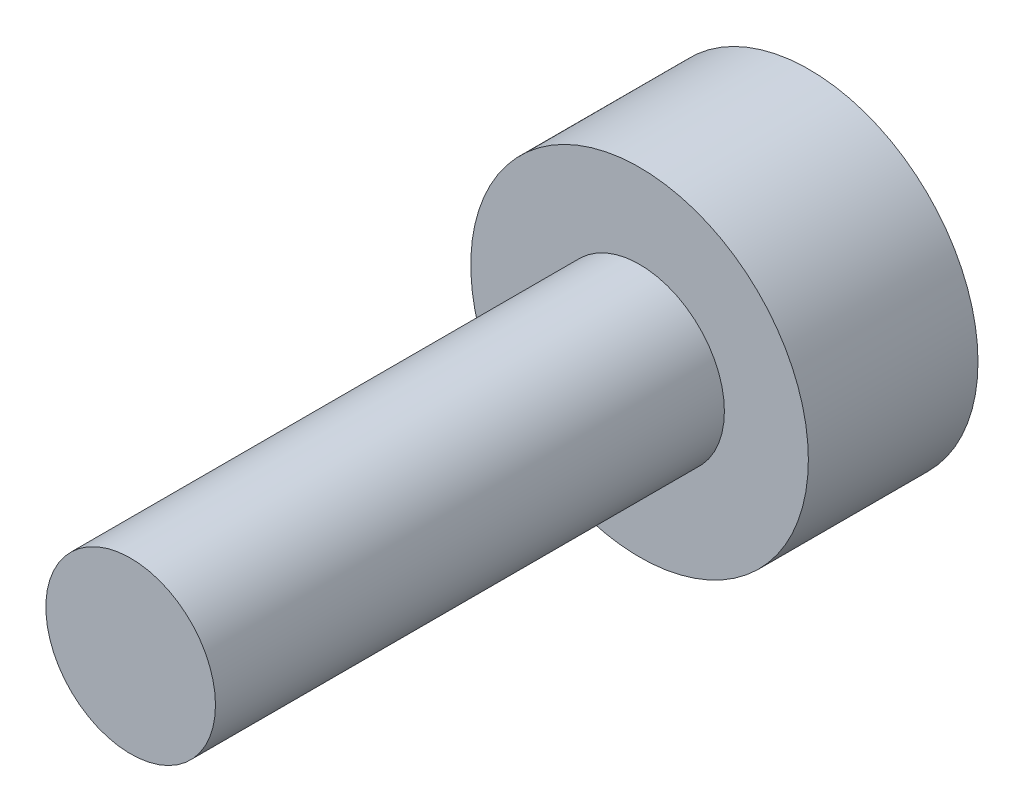
ISO-10303-21;
HEADER;
FILE_DESCRIPTION(('STEP AP214'),'2;1');
FILE_NAME('part.step','',(''),(''),'','','');
FILE_SCHEMA(('AUTOMOTIVE_DESIGN { 1 0 10303 214 1 1 1 1 }'));
ENDSEC;
DATA;
#1=APPLICATION_CONTEXT('core data for automotive mechanical design processes');
#2=APPLICATION_PROTOCOL_DEFINITION('international standard','automotive_design',2000,#1);
#3=PRODUCT_CONTEXT('',#1,'mechanical');
#4=PRODUCT('Part','Part','',(#3));
#5=PRODUCT_RELATED_PRODUCT_CATEGORY('part','',(#4));
#6=PRODUCT_DEFINITION_FORMATION('','',#4);
#7=PRODUCT_DEFINITION_CONTEXT('part definition',#1,'design');
#8=PRODUCT_DEFINITION('design','',#6,#7);
#9=PRODUCT_DEFINITION_SHAPE('','',#8);
#10=(LENGTH_UNIT() NAMED_UNIT(*) SI_UNIT(.MILLI.,.METRE.));
#11=(NAMED_UNIT(*) PLANE_ANGLE_UNIT() SI_UNIT($,.RADIAN.));
#12=(NAMED_UNIT(*) SI_UNIT($,.STERADIAN.) SOLID_ANGLE_UNIT());
#13=UNCERTAINTY_MEASURE_WITH_UNIT(LENGTH_MEASURE(1.E-05),#10,'distance_accuracy_value','');
#14=(GEOMETRIC_REPRESENTATION_CONTEXT(3) GLOBAL_UNCERTAINTY_ASSIGNED_CONTEXT((#13)) GLOBAL_UNIT_ASSIGNED_CONTEXT((#10,
#11,#12)) REPRESENTATION_CONTEXT('',''));
#15=CARTESIAN_POINT('',(0.,0.,0.));
#16=DIRECTION('',(0.,0.,1.));
#17=DIRECTION('',(1.,0.,0.));
#18=AXIS2_PLACEMENT_3D('',#15,#16,#17);
#19=CARTESIAN_POINT('',(0.,0.,2.));
#20=DIRECTION('',(0.,0.,-1.));
#21=DIRECTION('',(-1.,0.,0.));
#22=AXIS2_PLACEMENT_3D('',#19,#20,#21);
#23=CYLINDRICAL_SURFACE('',#22,1.99);
#24=CARTESIAN_POINT('',(0.,0.,2.));
#25=DIRECTION('',(0.,0.,1.));
#26=DIRECTION('',(1.,0.,0.));
#27=AXIS2_PLACEMENT_3D('',#24,#25,#26);
#28=CIRCLE('',#27,1.99);
#29=CARTESIAN_POINT('',(1.99,0.,2.));
#30=VERTEX_POINT('',#29);
#31=EDGE_CURVE('E11',#30,#30,#28,.T.);
#32=ORIENTED_EDGE('',*,*,#31,.F.);
#33=EDGE_LOOP('',(#32));
#34=FACE_BOUND('',#33,.T.);
#35=CARTESIAN_POINT('',(0.,0.,0.));
#36=DIRECTION('',(0.,0.,1.));
#37=DIRECTION('',(1.,0.,0.));
#38=AXIS2_PLACEMENT_3D('',#35,#36,#37);
#39=CIRCLE('',#38,1.99);
#40=CARTESIAN_POINT('',(1.99,0.,0.));
#41=VERTEX_POINT('',#40);
#42=EDGE_CURVE('E39',#41,#41,#39,.T.);
#43=ORIENTED_EDGE('',*,*,#42,.T.);
#44=EDGE_LOOP('',(#43));
#45=FACE_BOUND('',#44,.T.);
#46=ADVANCED_FACE('F36',(#34,#45),#23,.T.);
#47=CARTESIAN_POINT('',(0.,0.,2.));
#48=DIRECTION('',(0.,0.,1.));
#49=DIRECTION('',(1.,0.,0.));
#50=AXIS2_PLACEMENT_3D('',#47,#48,#49);
#51=PLANE('',#50);
#52=CARTESIAN_POINT('',(0.,0.,2.));
#53=DIRECTION('',(0.,0.,1.));
#54=DIRECTION('',(1.,0.,0.));
#55=AXIS2_PLACEMENT_3D('',#52,#53,#54);
#56=CIRCLE('',#55,1.);
#57=CARTESIAN_POINT('',(1.,0.,2.));
#58=VERTEX_POINT('',#57);
#59=EDGE_CURVE('E137',#58,#58,#56,.T.);
#60=ORIENTED_EDGE('',*,*,#59,.F.);
#61=EDGE_LOOP('',(#60));
#62=FACE_BOUND('',#61,.T.);
#63=ORIENTED_EDGE('',*,*,#31,.T.);
#64=EDGE_LOOP('',(#63));
#65=FACE_BOUND('',#64,.T.);
#66=ADVANCED_FACE('F151',(#62,#65),#51,.T.);
#67=CARTESIAN_POINT('',(0.,0.,0.));
#68=DIRECTION('',(0.,0.,1.));
#69=DIRECTION('',(1.,0.,0.));
#70=AXIS2_PLACEMENT_3D('',#67,#68,#69);
#71=PLANE('',#70);
#72=DIRECTION('',(0.5,0.866025403784438,0.));
#73=VECTOR('',#72,1.);
#74=CARTESIAN_POINT('',(-0.900666419935816,0.,0.));
#75=LINE('',#74,#73);
#76=CARTESIAN_POINT('',(-0.900666419935816,0.,0.));
#77=VERTEX_POINT('',#76);
#78=CARTESIAN_POINT('',(-0.450333209967908,0.78,0.));
#79=VERTEX_POINT('',#78);
#80=EDGE_CURVE('E124',#77,#79,#75,.T.);
#81=ORIENTED_EDGE('',*,*,#80,.F.);
#82=DIRECTION('',(-0.5,0.866025403784439,0.));
#83=VECTOR('',#82,1.);
#84=CARTESIAN_POINT('',(-0.450333209967908,-0.78,0.));
#85=LINE('',#84,#83);
#86=CARTESIAN_POINT('',(-0.450333209967908,-0.78,0.));
#87=VERTEX_POINT('',#86);
#88=EDGE_CURVE('E50',#87,#77,#85,.T.);
#89=ORIENTED_EDGE('',*,*,#88,.F.);
#90=DIRECTION('',(-1.,0.,0.));
#91=VECTOR('',#90,1.);
#92=CARTESIAN_POINT('',(0.450333209967908,-0.78,0.));
#93=LINE('',#92,#91);
#94=CARTESIAN_POINT('',(0.450333209967908,-0.78,0.));
#95=VERTEX_POINT('',#94);
#96=EDGE_CURVE('E133',#95,#87,#93,.T.);
#97=ORIENTED_EDGE('',*,*,#96,.F.);
#98=DIRECTION('',(-0.5,-0.866025403784439,0.));
#99=VECTOR('',#98,1.);
#100=CARTESIAN_POINT('',(0.900666419935816,0.,0.));
#101=LINE('',#100,#99);
#102=CARTESIAN_POINT('',(0.900666419935816,0.,0.));
#103=VERTEX_POINT('',#102);
#104=EDGE_CURVE('E131',#103,#95,#101,.T.);
#105=ORIENTED_EDGE('',*,*,#104,.F.);
#106=DIRECTION('',(0.5,-0.866025403784439,0.));
#107=VECTOR('',#106,1.);
#108=CARTESIAN_POINT('',(0.450333209967908,0.78,0.));
#109=LINE('',#108,#107);
#110=CARTESIAN_POINT('',(0.450333209967908,0.78,0.));
#111=VERTEX_POINT('',#110);
#112=EDGE_CURVE('E98',#111,#103,#109,.T.);
#113=ORIENTED_EDGE('',*,*,#112,.F.);
#114=DIRECTION('',(1.,0.,0.));
#115=VECTOR('',#114,1.);
#116=CARTESIAN_POINT('',(-0.450333209967908,0.78,0.));
#117=LINE('',#116,#115);
#118=EDGE_CURVE('E127',#79,#111,#117,.T.);
#119=ORIENTED_EDGE('',*,*,#118,.F.);
#120=EDGE_LOOP('',(#81,#89,#97,#105,#113,#119));
#121=FACE_BOUND('',#120,.T.);
#122=ORIENTED_EDGE('',*,*,#42,.F.);
#123=EDGE_LOOP('',(#122));
#124=FACE_BOUND('',#123,.T.);
#125=ADVANCED_FACE('F154',(#121,#124),#71,.F.);
#126=CARTESIAN_POINT('',(0.,0.,8.));
#127=DIRECTION('',(0.,0.,-1.));
#128=DIRECTION('',(-1.,0.,0.));
#129=AXIS2_PLACEMENT_3D('',#126,#127,#128);
#130=CYLINDRICAL_SURFACE('',#129,1.);
#131=CARTESIAN_POINT('',(0.,0.,8.));
#132=DIRECTION('',(0.,0.,1.));
#133=DIRECTION('',(1.,0.,0.));
#134=AXIS2_PLACEMENT_3D('',#131,#132,#133);
#135=CIRCLE('',#134,1.);
#136=CARTESIAN_POINT('',(1.,0.,8.));
#137=VERTEX_POINT('',#136);
#138=EDGE_CURVE('E143',#137,#137,#135,.T.);
#139=ORIENTED_EDGE('',*,*,#138,.F.);
#140=EDGE_LOOP('',(#139));
#141=FACE_BOUND('',#140,.T.);
#142=ORIENTED_EDGE('',*,*,#59,.T.);
#143=EDGE_LOOP('',(#142));
#144=FACE_BOUND('',#143,.T.);
#145=ADVANCED_FACE('F149',(#141,#144),#130,.T.);
#146=CARTESIAN_POINT('',(0.,0.,8.));
#147=DIRECTION('',(0.,0.,1.));
#148=DIRECTION('',(1.,0.,0.));
#149=AXIS2_PLACEMENT_3D('',#146,#147,#148);
#150=PLANE('',#149);
#151=ORIENTED_EDGE('',*,*,#138,.T.);
#152=EDGE_LOOP('',(#151));
#153=FACE_BOUND('',#152,.T.);
#154=ADVANCED_FACE('F168',(#153),#150,.T.);
#155=CARTESIAN_POINT('',(-0.450333209967908,-0.78,1.));
#156=DIRECTION('',(-0.866025403784439,-0.5,0.));
#157=DIRECTION('',(0.5,-0.866025403784439,0.));
#158=AXIS2_PLACEMENT_3D('',#155,#156,#157);
#159=PLANE('',#158);
#160=ORIENTED_EDGE('',*,*,#88,.T.);
#161=DIRECTION('',(0.,0.,-1.));
#162=VECTOR('',#161,1.);
#163=CARTESIAN_POINT('',(-0.900666419935816,0.,1.));
#164=LINE('',#163,#162);
#165=CARTESIAN_POINT('',(-0.900666419935816,0.,1.));
#166=VERTEX_POINT('',#165);
#167=EDGE_CURVE('E80',#166,#77,#164,.T.);
#168=ORIENTED_EDGE('',*,*,#167,.F.);
#169=DIRECTION('',(-0.5,0.866025403784439,0.));
#170=VECTOR('',#169,1.);
#171=CARTESIAN_POINT('',(-0.450333209967908,-0.78,1.));
#172=LINE('',#171,#170);
#173=CARTESIAN_POINT('',(-0.450333209967908,-0.78,1.));
#174=VERTEX_POINT('',#173);
#175=EDGE_CURVE('E135',#174,#166,#172,.T.);
#176=ORIENTED_EDGE('',*,*,#175,.F.);
#177=DIRECTION('',(0.,0.,-1.));
#178=VECTOR('',#177,1.);
#179=CARTESIAN_POINT('',(-0.450333209967908,-0.78,1.));
#180=LINE('',#179,#178);
#181=EDGE_CURVE('E58',#174,#87,#180,.T.);
#182=ORIENTED_EDGE('',*,*,#181,.T.);
#183=EDGE_LOOP('',(#160,#168,#176,#182));
#184=FACE_BOUND('',#183,.T.);
#185=ADVANCED_FACE('F175',(#184),#159,.F.);
#186=CARTESIAN_POINT('',(0.450333209967908,-0.78,1.));
#187=DIRECTION('',(0.,-1.,0.));
#188=DIRECTION('',(0.,0.,-1.));
#189=AXIS2_PLACEMENT_3D('',#186,#187,#188);
#190=PLANE('',#189);
#191=ORIENTED_EDGE('',*,*,#96,.T.);
#192=ORIENTED_EDGE('',*,*,#181,.F.);
#193=DIRECTION('',(-1.,0.,0.));
#194=VECTOR('',#193,1.);
#195=CARTESIAN_POINT('',(0.450333209967908,-0.78,1.));
#196=LINE('',#195,#194);
#197=CARTESIAN_POINT('',(0.450333209967908,-0.78,1.));
#198=VERTEX_POINT('',#197);
#199=EDGE_CURVE('E110',#198,#174,#196,.T.);
#200=ORIENTED_EDGE('',*,*,#199,.F.);
#201=DIRECTION('',(0.,0.,-1.));
#202=VECTOR('',#201,1.);
#203=CARTESIAN_POINT('',(0.450333209967908,-0.78,1.));
#204=LINE('',#203,#202);
#205=EDGE_CURVE('E102',#198,#95,#204,.T.);
#206=ORIENTED_EDGE('',*,*,#205,.T.);
#207=EDGE_LOOP('',(#191,#192,#200,#206));
#208=FACE_BOUND('',#207,.T.);
#209=ADVANCED_FACE('F179',(#208),#190,.F.);
#210=CARTESIAN_POINT('',(0.900666419935816,0.,1.));
#211=DIRECTION('',(0.866025403784439,-0.5,0.));
#212=DIRECTION('',(0.5,0.866025403784439,0.));
#213=AXIS2_PLACEMENT_3D('',#210,#211,#212);
#214=PLANE('',#213);
#215=ORIENTED_EDGE('',*,*,#104,.T.);
#216=ORIENTED_EDGE('',*,*,#205,.F.);
#217=DIRECTION('',(-0.5,-0.866025403784439,0.));
#218=VECTOR('',#217,1.);
#219=CARTESIAN_POINT('',(0.900666419935816,0.,1.));
#220=LINE('',#219,#218);
#221=CARTESIAN_POINT('',(0.900666419935816,0.,1.));
#222=VERTEX_POINT('',#221);
#223=EDGE_CURVE('E106',#222,#198,#220,.T.);
#224=ORIENTED_EDGE('',*,*,#223,.F.);
#225=DIRECTION('',(0.,0.,-1.));
#226=VECTOR('',#225,1.);
#227=CARTESIAN_POINT('',(0.900666419935816,0.,1.));
#228=LINE('',#227,#226);
#229=EDGE_CURVE('E91',#222,#103,#228,.T.);
#230=ORIENTED_EDGE('',*,*,#229,.T.);
#231=EDGE_LOOP('',(#215,#216,#224,#230));
#232=FACE_BOUND('',#231,.T.);
#233=ADVANCED_FACE('F107',(#232),#214,.F.);
#234=CARTESIAN_POINT('',(0.450333209967908,0.78,1.));
#235=DIRECTION('',(0.866025403784439,0.5,0.));
#236=DIRECTION('',(-0.5,0.866025403784439,0.));
#237=AXIS2_PLACEMENT_3D('',#234,#235,#236);
#238=PLANE('',#237);
#239=ORIENTED_EDGE('',*,*,#112,.T.);
#240=ORIENTED_EDGE('',*,*,#229,.F.);
#241=DIRECTION('',(0.5,-0.866025403784439,0.));
#242=VECTOR('',#241,1.);
#243=CARTESIAN_POINT('',(0.450333209967908,0.78,1.));
#244=LINE('',#243,#242);
#245=CARTESIAN_POINT('',(0.450333209967908,0.78,1.));
#246=VERTEX_POINT('',#245);
#247=EDGE_CURVE('E95',#246,#222,#244,.T.);
#248=ORIENTED_EDGE('',*,*,#247,.F.);
#249=DIRECTION('',(0.,0.,-1.));
#250=VECTOR('',#249,1.);
#251=CARTESIAN_POINT('',(0.450333209967908,0.78,1.));
#252=LINE('',#251,#250);
#253=EDGE_CURVE('E103',#246,#111,#252,.T.);
#254=ORIENTED_EDGE('',*,*,#253,.T.);
#255=EDGE_LOOP('',(#239,#240,#248,#254));
#256=FACE_BOUND('',#255,.T.);
#257=ADVANCED_FACE('F93',(#256),#238,.F.);
#258=CARTESIAN_POINT('',(-0.450333209967908,0.78,1.));
#259=DIRECTION('',(0.,1.,0.));
#260=DIRECTION('',(0.,0.,1.));
#261=AXIS2_PLACEMENT_3D('',#258,#259,#260);
#262=PLANE('',#261);
#263=ORIENTED_EDGE('',*,*,#118,.T.);
#264=ORIENTED_EDGE('',*,*,#253,.F.);
#265=DIRECTION('',(1.,0.,0.));
#266=VECTOR('',#265,1.);
#267=CARTESIAN_POINT('',(-0.450333209967908,0.78,1.));
#268=LINE('',#267,#266);
#269=CARTESIAN_POINT('',(-0.450333209967908,0.78,1.));
#270=VERTEX_POINT('',#269);
#271=EDGE_CURVE('E116',#270,#246,#268,.T.);
#272=ORIENTED_EDGE('',*,*,#271,.F.);
#273=DIRECTION('',(0.,0.,-1.));
#274=VECTOR('',#273,1.);
#275=CARTESIAN_POINT('',(-0.450333209967908,0.78,1.));
#276=LINE('',#275,#274);
#277=EDGE_CURVE('E140',#270,#79,#276,.T.);
#278=ORIENTED_EDGE('',*,*,#277,.T.);
#279=EDGE_LOOP('',(#263,#264,#272,#278));
#280=FACE_BOUND('',#279,.T.);
#281=ADVANCED_FACE('F183',(#280),#262,.F.);
#282=CARTESIAN_POINT('',(-0.900666419935816,0.,1.));
#283=DIRECTION('',(-0.866025403784439,0.5,0.));
#284=DIRECTION('',(-0.5,-0.866025403784438,0.));
#285=AXIS2_PLACEMENT_3D('',#282,#283,#284);
#286=PLANE('',#285);
#287=ORIENTED_EDGE('',*,*,#80,.T.);
#288=ORIENTED_EDGE('',*,*,#277,.F.);
#289=DIRECTION('',(0.5,0.866025403784438,0.));
#290=VECTOR('',#289,1.);
#291=CARTESIAN_POINT('',(-0.900666419935816,0.,1.));
#292=LINE('',#291,#290);
#293=EDGE_CURVE('E118',#166,#270,#292,.T.);
#294=ORIENTED_EDGE('',*,*,#293,.F.);
#295=ORIENTED_EDGE('',*,*,#167,.T.);
#296=EDGE_LOOP('',(#287,#288,#294,#295));
#297=FACE_BOUND('',#296,.T.);
#298=ADVANCED_FACE('F180',(#297),#286,.F.);
#299=CARTESIAN_POINT('',(0.,0.,1.));
#300=DIRECTION('',(0.,0.,-1.));
#301=DIRECTION('',(-1.,0.,0.));
#302=AXIS2_PLACEMENT_3D('',#299,#300,#301);
#303=PLANE('',#302);
#304=ORIENTED_EDGE('',*,*,#175,.T.);
#305=ORIENTED_EDGE('',*,*,#293,.T.);
#306=ORIENTED_EDGE('',*,*,#271,.T.);
#307=ORIENTED_EDGE('',*,*,#247,.T.);
#308=ORIENTED_EDGE('',*,*,#223,.T.);
#309=ORIENTED_EDGE('',*,*,#199,.T.);
#310=EDGE_LOOP('',(#304,#305,#306,#307,#308,#309));
#311=FACE_BOUND('',#310,.T.);
#312=ADVANCED_FACE('F113',(#311),#303,.T.);
#313=CLOSED_SHELL('',(#46,#66,#125,#145,#154,#185,#209,#233,#257,#281,#298,#312));
#314=MANIFOLD_SOLID_BREP('B2',#313);
#315=ADVANCED_BREP_SHAPE_REPRESENTATION('',(#18,#314),#14);
#316=SHAPE_DEFINITION_REPRESENTATION(#9,#315);
ENDSEC;
END-ISO-10303-21;
